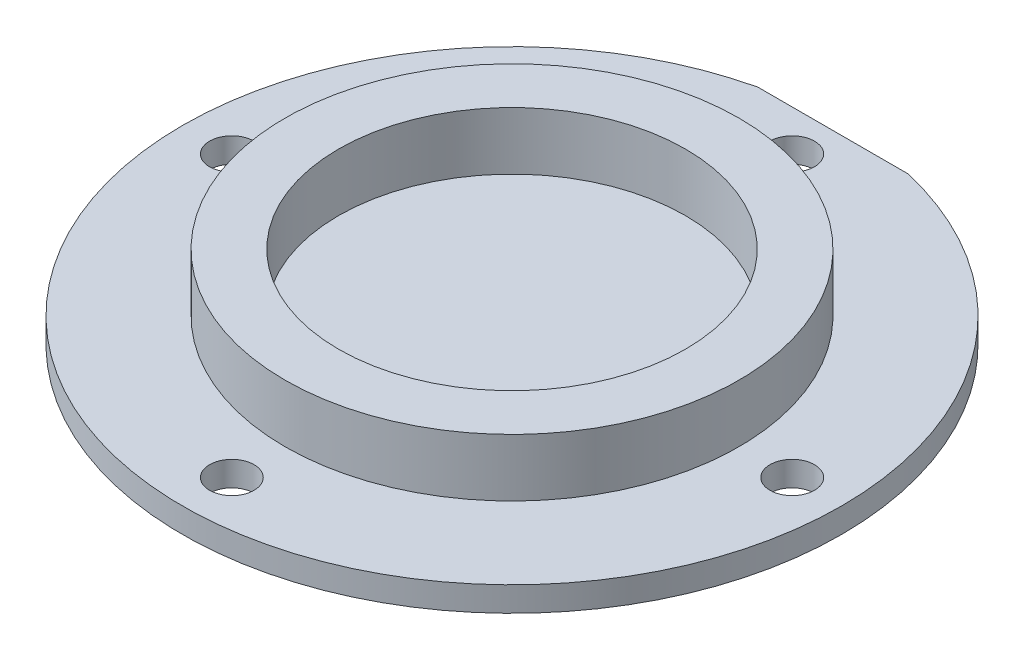
ISO-10303-21;
HEADER;
FILE_DESCRIPTION(('STEP AP214'),'2;1');
FILE_NAME('part.step','',(''),(''),'','','');
FILE_SCHEMA(('AUTOMOTIVE_DESIGN { 1 0 10303 214 1 1 1 1 }'));
ENDSEC;
DATA;
#1=APPLICATION_CONTEXT('core data for automotive mechanical design processes');
#2=APPLICATION_PROTOCOL_DEFINITION('international standard','automotive_design',2000,#1);
#3=PRODUCT_CONTEXT('',#1,'mechanical');
#4=PRODUCT('Part','Part','',(#3));
#5=PRODUCT_RELATED_PRODUCT_CATEGORY('part','',(#4));
#6=PRODUCT_DEFINITION_FORMATION('','',#4);
#7=PRODUCT_DEFINITION_CONTEXT('part definition',#1,'design');
#8=PRODUCT_DEFINITION('design','',#6,#7);
#9=PRODUCT_DEFINITION_SHAPE('','',#8);
#10=(LENGTH_UNIT() NAMED_UNIT(*) SI_UNIT(.MILLI.,.METRE.));
#11=(NAMED_UNIT(*) PLANE_ANGLE_UNIT() SI_UNIT($,.RADIAN.));
#12=(NAMED_UNIT(*) SI_UNIT($,.STERADIAN.) SOLID_ANGLE_UNIT());
#13=UNCERTAINTY_MEASURE_WITH_UNIT(LENGTH_MEASURE(1.E-05),#10,'distance_accuracy_value','');
#14=(GEOMETRIC_REPRESENTATION_CONTEXT(3) GLOBAL_UNCERTAINTY_ASSIGNED_CONTEXT((#13)) GLOBAL_UNIT_ASSIGNED_CONTEXT((#10,
#11,#12)) REPRESENTATION_CONTEXT('',''));
#15=CARTESIAN_POINT('',(0.,0.,0.));
#16=DIRECTION('',(0.,0.,1.));
#17=DIRECTION('',(1.,0.,0.));
#18=AXIS2_PLACEMENT_3D('',#15,#16,#17);
#19=CARTESIAN_POINT('',(0.,3.,0.));
#20=DIRECTION('',(0.,1.,0.));
#21=DIRECTION('',(0.,0.,1.));
#22=AXIS2_PLACEMENT_3D('',#19,#20,#21);
#23=PLANE('',#22);
#24=CARTESIAN_POINT('',(0.,3.,0.));
#25=DIRECTION('',(0.,1.,0.));
#26=DIRECTION('',(0.,0.,1.));
#27=AXIS2_PLACEMENT_3D('',#24,#25,#26);
#28=CIRCLE('',#27,27.55);
#29=CARTESIAN_POINT('',(0.,3.,27.55));
#30=VERTEX_POINT('',#29);
#31=EDGE_CURVE('E112',#30,#30,#28,.T.);
#32=ORIENTED_EDGE('',*,*,#31,.F.);
#33=EDGE_LOOP('',(#32));
#34=FACE_BOUND('',#33,.T.);
#35=CARTESIAN_POINT('',(-34.0073790530887,3.,0.));
#36=DIRECTION('',(0.,1.,0.));
#37=DIRECTION('',(0.,0.,1.));
#38=AXIS2_PLACEMENT_3D('',#35,#36,#37);
#39=CIRCLE('',#38,2.7);
#40=CARTESIAN_POINT('',(-34.0073790530887,3.,2.70000000000004));
#41=VERTEX_POINT('',#40);
#42=EDGE_CURVE('E97',#41,#41,#39,.T.);
#43=ORIENTED_EDGE('',*,*,#42,.F.);
#44=EDGE_LOOP('',(#43));
#45=FACE_BOUND('',#44,.T.);
#46=CARTESIAN_POINT('',(0.,3.,-34.0073790530887));
#47=DIRECTION('',(0.,1.,0.));
#48=DIRECTION('',(0.,0.,1.));
#49=AXIS2_PLACEMENT_3D('',#46,#47,#48);
#50=CIRCLE('',#49,2.7);
#51=CARTESIAN_POINT('',(0.,3.,-31.3073790530887));
#52=VERTEX_POINT('',#51);
#53=EDGE_CURVE('E83',#52,#52,#50,.T.);
#54=ORIENTED_EDGE('',*,*,#53,.F.);
#55=EDGE_LOOP('',(#54));
#56=FACE_BOUND('',#55,.T.);
#57=CARTESIAN_POINT('',(0.,3.,0.));
#58=DIRECTION('',(0.,1.,0.));
#59=DIRECTION('',(0.,0.,1.));
#60=AXIS2_PLACEMENT_3D('',#57,#58,#59);
#61=CIRCLE('',#60,40.);
#62=CARTESIAN_POINT('',(-9.11971667951281,3.,-38.9465116240905));
#63=VERTEX_POINT('',#62);
#64=CARTESIAN_POINT('',(9.11971667951288,3.,-38.9465116240905));
#65=VERTEX_POINT('',#64);
#66=EDGE_CURVE('E76',#63,#65,#61,.T.);
#67=ORIENTED_EDGE('',*,*,#66,.T.);
#68=DIRECTION('',(-1.,0.,0.));
#69=VECTOR('',#68,1.);
#70=CARTESIAN_POINT('',(-9.11971667951281,3.,-38.9465116240905));
#71=LINE('',#70,#69);
#72=EDGE_CURVE('E59',#65,#63,#71,.T.);
#73=ORIENTED_EDGE('',*,*,#72,.T.);
#74=EDGE_LOOP('',(#67,#73));
#75=FACE_BOUND('',#74,.T.);
#76=CARTESIAN_POINT('',(34.0073790530888,3.,0.));
#77=DIRECTION('',(0.,1.,0.));
#78=DIRECTION('',(0.,0.,1.));
#79=AXIS2_PLACEMENT_3D('',#76,#77,#78);
#80=CIRCLE('',#79,2.7);
#81=CARTESIAN_POINT('',(34.0073790530888,3.,2.69999999999996));
#82=VERTEX_POINT('',#81);
#83=EDGE_CURVE('E92',#82,#82,#80,.T.);
#84=ORIENTED_EDGE('',*,*,#83,.F.);
#85=EDGE_LOOP('',(#84));
#86=FACE_BOUND('',#85,.T.);
#87=CARTESIAN_POINT('',(0.,3.,34.0073790530887));
#88=DIRECTION('',(0.,1.,0.));
#89=DIRECTION('',(0.,0.,1.));
#90=AXIS2_PLACEMENT_3D('',#87,#88,#89);
#91=CIRCLE('',#90,2.69999999999999);
#92=CARTESIAN_POINT('',(0.,3.,36.7073790530887));
#93=VERTEX_POINT('',#92);
#94=EDGE_CURVE('E103',#93,#93,#91,.T.);
#95=ORIENTED_EDGE('',*,*,#94,.F.);
#96=EDGE_LOOP('',(#95));
#97=FACE_BOUND('',#96,.T.);
#98=ADVANCED_FACE('F43',(#34,#45,#56,#75,#86,#97),#23,.T.);
#99=CARTESIAN_POINT('',(0.,0.,0.));
#100=DIRECTION('',(0.,1.,0.));
#101=DIRECTION('',(0.,0.,1.));
#102=AXIS2_PLACEMENT_3D('',#99,#100,#101);
#103=PLANE('',#102);
#104=CARTESIAN_POINT('',(0.,0.,0.));
#105=DIRECTION('',(0.,1.,0.));
#106=DIRECTION('',(0.,0.,1.));
#107=AXIS2_PLACEMENT_3D('',#104,#105,#106);
#108=CIRCLE('',#107,40.);
#109=CARTESIAN_POINT('',(-9.11971667951281,0.,-38.9465116240905));
#110=VERTEX_POINT('',#109);
#111=CARTESIAN_POINT('',(9.11971667951288,0.,-38.9465116240905));
#112=VERTEX_POINT('',#111);
#113=EDGE_CURVE('E77',#110,#112,#108,.T.);
#114=ORIENTED_EDGE('',*,*,#113,.F.);
#115=DIRECTION('',(-1.,0.,0.));
#116=VECTOR('',#115,1.);
#117=CARTESIAN_POINT('',(-9.11971667951281,0.,-38.9465116240905));
#118=LINE('',#117,#116);
#119=EDGE_CURVE('E67',#112,#110,#118,.T.);
#120=ORIENTED_EDGE('',*,*,#119,.F.);
#121=EDGE_LOOP('',(#114,#120));
#122=FACE_BOUND('',#121,.T.);
#123=CARTESIAN_POINT('',(0.,0.,-34.0073790530887));
#124=DIRECTION('',(0.,1.,0.));
#125=DIRECTION('',(0.,0.,1.));
#126=AXIS2_PLACEMENT_3D('',#123,#124,#125);
#127=CIRCLE('',#126,2.7);
#128=CARTESIAN_POINT('',(0.,0.,-31.3073790530887));
#129=VERTEX_POINT('',#128);
#130=EDGE_CURVE('E86',#129,#129,#127,.T.);
#131=ORIENTED_EDGE('',*,*,#130,.T.);
#132=EDGE_LOOP('',(#131));
#133=FACE_BOUND('',#132,.T.);
#134=CARTESIAN_POINT('',(34.0073790530888,0.,0.));
#135=DIRECTION('',(0.,1.,0.));
#136=DIRECTION('',(0.,0.,1.));
#137=AXIS2_PLACEMENT_3D('',#134,#135,#136);
#138=CIRCLE('',#137,2.7);
#139=CARTESIAN_POINT('',(34.0073790530888,0.,2.69999999999996));
#140=VERTEX_POINT('',#139);
#141=EDGE_CURVE('E94',#140,#140,#138,.T.);
#142=ORIENTED_EDGE('',*,*,#141,.T.);
#143=EDGE_LOOP('',(#142));
#144=FACE_BOUND('',#143,.T.);
#145=CARTESIAN_POINT('',(-34.0073790530887,0.,0.));
#146=DIRECTION('',(0.,1.,0.));
#147=DIRECTION('',(0.,0.,1.));
#148=AXIS2_PLACEMENT_3D('',#145,#146,#147);
#149=CIRCLE('',#148,2.7);
#150=CARTESIAN_POINT('',(-34.0073790530887,0.,2.70000000000004));
#151=VERTEX_POINT('',#150);
#152=EDGE_CURVE('E100',#151,#151,#149,.T.);
#153=ORIENTED_EDGE('',*,*,#152,.T.);
#154=EDGE_LOOP('',(#153));
#155=FACE_BOUND('',#154,.T.);
#156=CARTESIAN_POINT('',(0.,0.,34.0073790530887));
#157=DIRECTION('',(0.,1.,0.));
#158=DIRECTION('',(0.,0.,1.));
#159=AXIS2_PLACEMENT_3D('',#156,#157,#158);
#160=CIRCLE('',#159,2.69999999999999);
#161=CARTESIAN_POINT('',(0.,0.,36.7073790530887));
#162=VERTEX_POINT('',#161);
#163=EDGE_CURVE('E106',#162,#162,#160,.T.);
#164=ORIENTED_EDGE('',*,*,#163,.T.);
#165=EDGE_LOOP('',(#164));
#166=FACE_BOUND('',#165,.T.);
#167=ADVANCED_FACE('F81',(#122,#133,#144,#155,#166),#103,.F.);
#168=CARTESIAN_POINT('',(0.,3.,0.));
#169=DIRECTION('',(0.,-1.,0.));
#170=DIRECTION('',(0.,0.,-1.));
#171=AXIS2_PLACEMENT_3D('',#168,#169,#170);
#172=CYLINDRICAL_SURFACE('',#171,40.);
#173=ORIENTED_EDGE('',*,*,#113,.T.);
#174=DIRECTION('',(0.,-1.,0.));
#175=VECTOR('',#174,1.);
#176=CARTESIAN_POINT('',(9.11971667951288,3.,-38.9465116240905));
#177=LINE('',#176,#175);
#178=EDGE_CURVE('E52',#65,#112,#177,.T.);
#179=ORIENTED_EDGE('',*,*,#178,.F.);
#180=ORIENTED_EDGE('',*,*,#66,.F.);
#181=DIRECTION('',(0.,-1.,0.));
#182=VECTOR('',#181,1.);
#183=CARTESIAN_POINT('',(-9.11971667951281,3.,-38.9465116240905));
#184=LINE('',#183,#182);
#185=EDGE_CURVE('E72',#63,#110,#184,.T.);
#186=ORIENTED_EDGE('',*,*,#185,.T.);
#187=EDGE_LOOP('',(#173,#179,#180,#186));
#188=FACE_BOUND('',#187,.T.);
#189=ADVANCED_FACE('F45',(#188),#172,.T.);
#190=CARTESIAN_POINT('',(-9.11971667951281,3.,-38.9465116240905));
#191=DIRECTION('',(0.,0.,1.));
#192=DIRECTION('',(1.,0.,0.));
#193=AXIS2_PLACEMENT_3D('',#190,#191,#192);
#194=PLANE('',#193);
#195=ORIENTED_EDGE('',*,*,#119,.T.);
#196=ORIENTED_EDGE('',*,*,#185,.F.);
#197=ORIENTED_EDGE('',*,*,#72,.F.);
#198=ORIENTED_EDGE('',*,*,#178,.T.);
#199=EDGE_LOOP('',(#195,#196,#197,#198));
#200=FACE_BOUND('',#199,.T.);
#201=ADVANCED_FACE('F71',(#200),#194,.F.);
#202=CARTESIAN_POINT('',(0.,3.,-34.0073790530887));
#203=DIRECTION('',(0.,-1.,0.));
#204=DIRECTION('',(0.,0.,-1.));
#205=AXIS2_PLACEMENT_3D('',#202,#203,#204);
#206=CYLINDRICAL_SURFACE('',#205,2.7);
#207=ORIENTED_EDGE('',*,*,#53,.T.);
#208=EDGE_LOOP('',(#207));
#209=FACE_BOUND('',#208,.T.);
#210=ORIENTED_EDGE('',*,*,#130,.F.);
#211=EDGE_LOOP('',(#210));
#212=FACE_BOUND('',#211,.T.);
#213=ADVANCED_FACE('F194',(#209,#212),#206,.F.);
#214=CARTESIAN_POINT('',(34.0073790530888,3.,0.));
#215=DIRECTION('',(0.,-1.,0.));
#216=DIRECTION('',(0.,0.,-1.));
#217=AXIS2_PLACEMENT_3D('',#214,#215,#216);
#218=CYLINDRICAL_SURFACE('',#217,2.7);
#219=ORIENTED_EDGE('',*,*,#83,.T.);
#220=EDGE_LOOP('',(#219));
#221=FACE_BOUND('',#220,.T.);
#222=ORIENTED_EDGE('',*,*,#141,.F.);
#223=EDGE_LOOP('',(#222));
#224=FACE_BOUND('',#223,.T.);
#225=ADVANCED_FACE('F184',(#221,#224),#218,.F.);
#226=CARTESIAN_POINT('',(-34.0073790530887,3.,0.));
#227=DIRECTION('',(0.,-1.,0.));
#228=DIRECTION('',(0.,0.,-1.));
#229=AXIS2_PLACEMENT_3D('',#226,#227,#228);
#230=CYLINDRICAL_SURFACE('',#229,2.7);
#231=ORIENTED_EDGE('',*,*,#42,.T.);
#232=EDGE_LOOP('',(#231));
#233=FACE_BOUND('',#232,.T.);
#234=ORIENTED_EDGE('',*,*,#152,.F.);
#235=EDGE_LOOP('',(#234));
#236=FACE_BOUND('',#235,.T.);
#237=ADVANCED_FACE('F137',(#233,#236),#230,.F.);
#238=CARTESIAN_POINT('',(0.,3.,34.0073790530887));
#239=DIRECTION('',(0.,-1.,0.));
#240=DIRECTION('',(0.,0.,-1.));
#241=AXIS2_PLACEMENT_3D('',#238,#239,#240);
#242=CYLINDRICAL_SURFACE('',#241,2.69999999999999);
#243=ORIENTED_EDGE('',*,*,#94,.T.);
#244=EDGE_LOOP('',(#243));
#245=FACE_BOUND('',#244,.T.);
#246=ORIENTED_EDGE('',*,*,#163,.F.);
#247=EDGE_LOOP('',(#246));
#248=FACE_BOUND('',#247,.T.);
#249=ADVANCED_FACE('F127',(#245,#248),#242,.F.);
#250=CARTESIAN_POINT('',(0.,10.,0.));
#251=DIRECTION('',(0.,1.,0.));
#252=DIRECTION('',(0.,0.,1.));
#253=AXIS2_PLACEMENT_3D('',#250,#251,#252);
#254=PLANE('',#253);
#255=CARTESIAN_POINT('',(0.,10.,0.));
#256=DIRECTION('',(0.,1.,0.));
#257=DIRECTION('',(0.,0.,1.));
#258=AXIS2_PLACEMENT_3D('',#255,#256,#257);
#259=CIRCLE('',#258,27.55);
#260=CARTESIAN_POINT('',(0.,10.,27.55));
#261=VERTEX_POINT('',#260);
#262=EDGE_CURVE('E109',#261,#261,#259,.T.);
#263=ORIENTED_EDGE('',*,*,#262,.T.);
#264=EDGE_LOOP('',(#263));
#265=FACE_BOUND('',#264,.T.);
#266=CARTESIAN_POINT('',(0.,10.,0.));
#267=DIRECTION('',(0.,1.,0.));
#268=DIRECTION('',(0.,0.,1.));
#269=AXIS2_PLACEMENT_3D('',#266,#267,#268);
#270=CIRCLE('',#269,21.05);
#271=CARTESIAN_POINT('',(0.,10.,21.05));
#272=VERTEX_POINT('',#271);
#273=EDGE_CURVE('E115',#272,#272,#270,.T.);
#274=ORIENTED_EDGE('',*,*,#273,.F.);
#275=EDGE_LOOP('',(#274));
#276=FACE_BOUND('',#275,.T.);
#277=ADVANCED_FACE('F124',(#265,#276),#254,.T.);
#278=CARTESIAN_POINT('',(0.,10.,0.));
#279=DIRECTION('',(0.,-1.,0.));
#280=DIRECTION('',(0.,0.,-1.));
#281=AXIS2_PLACEMENT_3D('',#278,#279,#280);
#282=CYLINDRICAL_SURFACE('',#281,27.55);
#283=ORIENTED_EDGE('',*,*,#262,.F.);
#284=EDGE_LOOP('',(#283));
#285=FACE_BOUND('',#284,.T.);
#286=ORIENTED_EDGE('',*,*,#31,.T.);
#287=EDGE_LOOP('',(#286));
#288=FACE_BOUND('',#287,.T.);
#289=ADVANCED_FACE('F126',(#285,#288),#282,.T.);
#290=CARTESIAN_POINT('',(0.,10.,0.));
#291=DIRECTION('',(0.,-1.,0.));
#292=DIRECTION('',(0.,0.,-1.));
#293=AXIS2_PLACEMENT_3D('',#290,#291,#292);
#294=CYLINDRICAL_SURFACE('',#293,21.05);
#295=ORIENTED_EDGE('',*,*,#273,.T.);
#296=EDGE_LOOP('',(#295));
#297=FACE_BOUND('',#296,.T.);
#298=CARTESIAN_POINT('',(0.,3.,0.));
#299=DIRECTION('',(0.,1.,0.));
#300=DIRECTION('',(0.,0.,1.));
#301=AXIS2_PLACEMENT_3D('',#298,#299,#300);
#302=CIRCLE('',#301,21.05);
#303=CARTESIAN_POINT('',(0.,3.,21.05));
#304=VERTEX_POINT('',#303);
#305=EDGE_CURVE('E11',#304,#304,#302,.F.);
#306=ORIENTED_EDGE('',*,*,#305,.T.);
#307=EDGE_LOOP('',(#306));
#308=FACE_BOUND('',#307,.T.);
#309=ADVANCED_FACE('F121',(#297,#308),#294,.F.);
#310=ORIENTED_EDGE('',*,*,#305,.F.);
#311=EDGE_LOOP('',(#310));
#312=FACE_BOUND('',#311,.T.);
#313=ADVANCED_FACE('F144',(#312),#23,.T.);
#314=CLOSED_SHELL('',(#98,#167,#189,#201,#213,#225,#237,#249,#277,#289,#309,#313));
#315=MANIFOLD_SOLID_BREP('B2',#314);
#316=ADVANCED_BREP_SHAPE_REPRESENTATION('',(#18,#315),#14);
#317=SHAPE_DEFINITION_REPRESENTATION(#9,#316);
ENDSEC;
END-ISO-10303-21;
